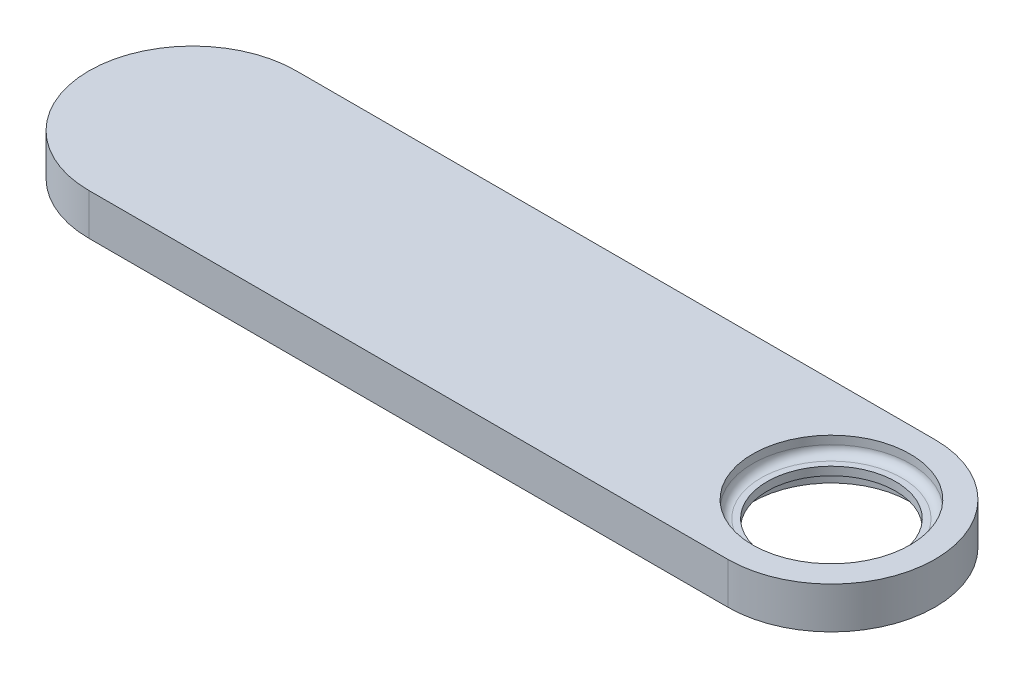
ISO-10303-21;
HEADER;
FILE_DESCRIPTION(('STEP AP214'),'2;1');
FILE_NAME('part.step','',(''),(''),'','','');
FILE_SCHEMA(('AUTOMOTIVE_DESIGN { 1 0 10303 214 1 1 1 1 }'));
ENDSEC;
DATA;
#1=APPLICATION_CONTEXT('core data for automotive mechanical design processes');
#2=APPLICATION_PROTOCOL_DEFINITION('international standard','automotive_design',2000,#1);
#3=PRODUCT_CONTEXT('',#1,'mechanical');
#4=PRODUCT('Part','Part','',(#3));
#5=PRODUCT_RELATED_PRODUCT_CATEGORY('part','',(#4));
#6=PRODUCT_DEFINITION_FORMATION('','',#4);
#7=PRODUCT_DEFINITION_CONTEXT('part definition',#1,'design');
#8=PRODUCT_DEFINITION('design','',#6,#7);
#9=PRODUCT_DEFINITION_SHAPE('','',#8);
#10=(LENGTH_UNIT() NAMED_UNIT(*) SI_UNIT(.MILLI.,.METRE.));
#11=(NAMED_UNIT(*) PLANE_ANGLE_UNIT() SI_UNIT($,.RADIAN.));
#12=(NAMED_UNIT(*) SI_UNIT($,.STERADIAN.) SOLID_ANGLE_UNIT());
#13=UNCERTAINTY_MEASURE_WITH_UNIT(LENGTH_MEASURE(1.E-05),#10,'distance_accuracy_value','');
#14=(GEOMETRIC_REPRESENTATION_CONTEXT(3) GLOBAL_UNCERTAINTY_ASSIGNED_CONTEXT((#13)) GLOBAL_UNIT_ASSIGNED_CONTEXT((#10,
#11,#12)) REPRESENTATION_CONTEXT('',''));
#15=CARTESIAN_POINT('',(0.,0.,0.));
#16=DIRECTION('',(0.,0.,1.));
#17=DIRECTION('',(1.,0.,0.));
#18=AXIS2_PLACEMENT_3D('',#15,#16,#17);
#19=CARTESIAN_POINT('',(38.5204081632653,-0.00100000000000013,0.));
#20=DIRECTION('',(0.,1.,0.));
#21=DIRECTION('',(0.,0.,1.));
#22=AXIS2_PLACEMENT_3D('',#19,#20,#21);
#23=CYLINDRICAL_SURFACE('',#22,7.75);
#24=CARTESIAN_POINT('',(38.5204081632653,3.,0.));
#25=DIRECTION('',(0.,1.,0.));
#26=DIRECTION('',(0.,0.,1.));
#27=AXIS2_PLACEMENT_3D('',#24,#25,#26);
#28=CIRCLE('',#27,7.75);
#29=CARTESIAN_POINT('',(38.5204081632653,3.,7.75));
#30=VERTEX_POINT('',#29);
#31=EDGE_CURVE('E106',#30,#30,#28,.F.);
#32=ORIENTED_EDGE('',*,*,#31,.F.);
#33=EDGE_LOOP('',(#32));
#34=FACE_BOUND('',#33,.T.);
#35=CARTESIAN_POINT('',(38.5204081632653,2.,0.));
#36=DIRECTION('',(0.,-1.,0.));
#37=DIRECTION('',(0.,0.,-1.));
#38=AXIS2_PLACEMENT_3D('',#35,#36,#37);
#39=CIRCLE('',#38,7.75);
#40=CARTESIAN_POINT('',(38.5204081632653,2.,-7.75));
#41=VERTEX_POINT('',#40);
#42=EDGE_CURVE('E117',#41,#41,#39,.F.);
#43=ORIENTED_EDGE('',*,*,#42,.F.);
#44=EDGE_LOOP('',(#43));
#45=FACE_BOUND('',#44,.T.);
#46=ADVANCED_FACE('F35',(#34,#45),#23,.F.);
#47=CARTESIAN_POINT('',(-38.5204081632653,5.,0.));
#48=DIRECTION('',(0.,-1.,0.));
#49=DIRECTION('',(0.,0.,-1.));
#50=AXIS2_PLACEMENT_3D('',#47,#48,#49);
#51=CYLINDRICAL_SURFACE('',#50,12.5);
#52=CARTESIAN_POINT('',(-38.5204081632653,0.,0.));
#53=DIRECTION('',(0.,1.,0.));
#54=DIRECTION('',(0.,0.,1.));
#55=AXIS2_PLACEMENT_3D('',#52,#53,#54);
#56=CIRCLE('',#55,12.5);
#57=CARTESIAN_POINT('',(-38.5204081632653,0.,-12.5));
#58=VERTEX_POINT('',#57);
#59=CARTESIAN_POINT('',(-38.5204081632653,0.,12.5));
#60=VERTEX_POINT('',#59);
#61=EDGE_CURVE('E103',#58,#60,#56,.T.);
#62=ORIENTED_EDGE('',*,*,#61,.T.);
#63=DIRECTION('',(0.,-1.,0.));
#64=VECTOR('',#63,1.);
#65=CARTESIAN_POINT('',(-38.5204081632653,5.,12.5));
#66=LINE('',#65,#64);
#67=CARTESIAN_POINT('',(-38.5204081632653,5.,12.5));
#68=VERTEX_POINT('',#67);
#69=EDGE_CURVE('E94',#68,#60,#66,.T.);
#70=ORIENTED_EDGE('',*,*,#69,.F.);
#71=CARTESIAN_POINT('',(-38.5204081632653,5.,0.));
#72=DIRECTION('',(0.,1.,0.));
#73=DIRECTION('',(0.,0.,1.));
#74=AXIS2_PLACEMENT_3D('',#71,#72,#73);
#75=CIRCLE('',#74,12.5);
#76=CARTESIAN_POINT('',(-38.5204081632653,5.,-12.5));
#77=VERTEX_POINT('',#76);
#78=EDGE_CURVE('E88',#77,#68,#75,.T.);
#79=ORIENTED_EDGE('',*,*,#78,.F.);
#80=DIRECTION('',(0.,-1.,0.));
#81=VECTOR('',#80,1.);
#82=CARTESIAN_POINT('',(-38.5204081632653,5.,-12.5));
#83=LINE('',#82,#81);
#84=EDGE_CURVE('E99',#77,#58,#83,.T.);
#85=ORIENTED_EDGE('',*,*,#84,.T.);
#86=EDGE_LOOP('',(#62,#70,#79,#85));
#87=FACE_BOUND('',#86,.T.);
#88=ADVANCED_FACE('F141',(#87),#51,.T.);
#89=CARTESIAN_POINT('',(-38.5204081632653,5.,12.5));
#90=DIRECTION('',(0.,0.,-1.));
#91=DIRECTION('',(-1.,0.,0.));
#92=AXIS2_PLACEMENT_3D('',#89,#90,#91);
#93=PLANE('',#92);
#94=DIRECTION('',(1.,0.,0.));
#95=VECTOR('',#94,1.);
#96=CARTESIAN_POINT('',(-38.5204081632653,0.,12.5));
#97=LINE('',#96,#95);
#98=CARTESIAN_POINT('',(38.5204081632653,0.,12.5));
#99=VERTEX_POINT('',#98);
#100=EDGE_CURVE('E93',#60,#99,#97,.T.);
#101=ORIENTED_EDGE('',*,*,#100,.T.);
#102=DIRECTION('',(0.,-1.,0.));
#103=VECTOR('',#102,1.);
#104=CARTESIAN_POINT('',(38.5204081632653,5.,12.5));
#105=LINE('',#104,#103);
#106=CARTESIAN_POINT('',(38.5204081632653,5.,12.5));
#107=VERTEX_POINT('',#106);
#108=EDGE_CURVE('E91',#107,#99,#105,.T.);
#109=ORIENTED_EDGE('',*,*,#108,.F.);
#110=DIRECTION('',(1.,0.,0.));
#111=VECTOR('',#110,1.);
#112=CARTESIAN_POINT('',(-38.5204081632653,5.,12.5));
#113=LINE('',#112,#111);
#114=EDGE_CURVE('E83',#68,#107,#113,.T.);
#115=ORIENTED_EDGE('',*,*,#114,.F.);
#116=ORIENTED_EDGE('',*,*,#69,.T.);
#117=EDGE_LOOP('',(#101,#109,#115,#116));
#118=FACE_BOUND('',#117,.T.);
#119=ADVANCED_FACE('F92',(#118),#93,.F.);
#120=CARTESIAN_POINT('',(38.5204081632653,5.,0.));
#121=DIRECTION('',(0.,-1.,0.));
#122=DIRECTION('',(0.,0.,-1.));
#123=AXIS2_PLACEMENT_3D('',#120,#121,#122);
#124=CYLINDRICAL_SURFACE('',#123,12.5);
#125=CARTESIAN_POINT('',(38.5204081632653,0.,0.));
#126=DIRECTION('',(0.,1.,0.));
#127=DIRECTION('',(0.,0.,1.));
#128=AXIS2_PLACEMENT_3D('',#125,#126,#127);
#129=CIRCLE('',#128,12.5);
#130=CARTESIAN_POINT('',(38.5204081632653,0.,-12.5));
#131=VERTEX_POINT('',#130);
#132=EDGE_CURVE('E69',#99,#131,#129,.T.);
#133=ORIENTED_EDGE('',*,*,#132,.T.);
#134=DIRECTION('',(0.,-1.,0.));
#135=VECTOR('',#134,1.);
#136=CARTESIAN_POINT('',(38.5204081632653,5.,-12.5));
#137=LINE('',#136,#135);
#138=CARTESIAN_POINT('',(38.5204081632653,5.,-12.5));
#139=VERTEX_POINT('',#138);
#140=EDGE_CURVE('E95',#139,#131,#137,.T.);
#141=ORIENTED_EDGE('',*,*,#140,.F.);
#142=CARTESIAN_POINT('',(38.5204081632653,5.,0.));
#143=DIRECTION('',(0.,1.,0.));
#144=DIRECTION('',(0.,0.,1.));
#145=AXIS2_PLACEMENT_3D('',#142,#143,#144);
#146=CIRCLE('',#145,12.5);
#147=EDGE_CURVE('E86',#107,#139,#146,.T.);
#148=ORIENTED_EDGE('',*,*,#147,.F.);
#149=ORIENTED_EDGE('',*,*,#108,.T.);
#150=EDGE_LOOP('',(#133,#141,#148,#149));
#151=FACE_BOUND('',#150,.T.);
#152=ADVANCED_FACE('F97',(#151),#124,.T.);
#153=CARTESIAN_POINT('',(-38.5204081632653,5.,-12.5));
#154=DIRECTION('',(0.,0.,1.));
#155=DIRECTION('',(1.,0.,0.));
#156=AXIS2_PLACEMENT_3D('',#153,#154,#155);
#157=PLANE('',#156);
#158=DIRECTION('',(-1.,0.,0.));
#159=VECTOR('',#158,1.);
#160=CARTESIAN_POINT('',(-38.5204081632653,0.,-12.5));
#161=LINE('',#160,#159);
#162=EDGE_CURVE('E75',#131,#58,#161,.T.);
#163=ORIENTED_EDGE('',*,*,#162,.T.);
#164=ORIENTED_EDGE('',*,*,#84,.F.);
#165=DIRECTION('',(-1.,0.,0.));
#166=VECTOR('',#165,1.);
#167=CARTESIAN_POINT('',(-38.5204081632653,5.,-12.5));
#168=LINE('',#167,#166);
#169=EDGE_CURVE('E52',#139,#77,#168,.T.);
#170=ORIENTED_EDGE('',*,*,#169,.F.);
#171=ORIENTED_EDGE('',*,*,#140,.T.);
#172=EDGE_LOOP('',(#163,#164,#170,#171));
#173=FACE_BOUND('',#172,.T.);
#174=ADVANCED_FACE('F158',(#173),#157,.F.);
#175=CARTESIAN_POINT('',(-38.5204081632653,5.,0.));
#176=DIRECTION('',(0.,1.,0.));
#177=DIRECTION('',(0.,0.,1.));
#178=AXIS2_PLACEMENT_3D('',#175,#176,#177);
#179=PLANE('',#178);
#180=CARTESIAN_POINT('',(38.5204081632653,5.,0.));
#181=DIRECTION('',(0.,1.,0.));
#182=DIRECTION('',(0.,0.,1.));
#183=AXIS2_PLACEMENT_3D('',#180,#181,#182);
#184=CIRCLE('',#183,9.5);
#185=CARTESIAN_POINT('',(38.5204081632653,5.,9.5));
#186=VERTEX_POINT('',#185);
#187=EDGE_CURVE('E116',#186,#186,#184,.T.);
#188=ORIENTED_EDGE('',*,*,#187,.F.);
#189=EDGE_LOOP('',(#188));
#190=FACE_BOUND('',#189,.T.);
#191=ORIENTED_EDGE('',*,*,#78,.T.);
#192=ORIENTED_EDGE('',*,*,#114,.T.);
#193=ORIENTED_EDGE('',*,*,#147,.T.);
#194=ORIENTED_EDGE('',*,*,#169,.T.);
#195=EDGE_LOOP('',(#191,#192,#193,#194));
#196=FACE_BOUND('',#195,.T.);
#197=ADVANCED_FACE('F84',(#190,#196),#179,.T.);
#198=CARTESIAN_POINT('',(-38.5204081632653,0.,0.));
#199=DIRECTION('',(0.,1.,0.));
#200=DIRECTION('',(0.,0.,1.));
#201=AXIS2_PLACEMENT_3D('',#198,#199,#200);
#202=PLANE('',#201);
#203=CARTESIAN_POINT('',(38.5204081632653,0.,0.));
#204=DIRECTION('',(0.,-1.,0.));
#205=DIRECTION('',(0.,0.,-1.));
#206=AXIS2_PLACEMENT_3D('',#203,#204,#205);
#207=CIRCLE('',#206,9.5);
#208=CARTESIAN_POINT('',(38.5204081632653,0.,-9.5));
#209=VERTEX_POINT('',#208);
#210=EDGE_CURVE('E120',#209,#209,#207,.T.);
#211=ORIENTED_EDGE('',*,*,#210,.F.);
#212=EDGE_LOOP('',(#211));
#213=FACE_BOUND('',#212,.T.);
#214=ORIENTED_EDGE('',*,*,#61,.F.);
#215=ORIENTED_EDGE('',*,*,#162,.F.);
#216=ORIENTED_EDGE('',*,*,#132,.F.);
#217=ORIENTED_EDGE('',*,*,#100,.F.);
#218=EDGE_LOOP('',(#214,#215,#216,#217));
#219=FACE_BOUND('',#218,.T.);
#220=ADVANCED_FACE('F157',(#213,#219),#202,.F.);
#221=CARTESIAN_POINT('',(38.5204081632653,3.,0.));
#222=DIRECTION('',(0.,1.,0.));
#223=DIRECTION('',(0.,0.,1.));
#224=AXIS2_PLACEMENT_3D('',#221,#222,#223);
#225=PLANE('',#224);
#226=CARTESIAN_POINT('',(38.5204081632653,3.,0.));
#227=DIRECTION('',(0.,1.,0.));
#228=DIRECTION('',(0.,0.,1.));
#229=AXIS2_PLACEMENT_3D('',#226,#227,#228);
#230=CIRCLE('',#229,8.5);
#231=CARTESIAN_POINT('',(38.5204081632653,3.,8.5));
#232=VERTEX_POINT('',#231);
#233=EDGE_CURVE('E113',#232,#232,#230,.T.);
#234=ORIENTED_EDGE('',*,*,#233,.T.);
#235=EDGE_LOOP('',(#234));
#236=FACE_BOUND('',#235,.T.);
#237=ORIENTED_EDGE('',*,*,#31,.T.);
#238=EDGE_LOOP('',(#237));
#239=FACE_BOUND('',#238,.T.);
#240=ADVANCED_FACE('F162',(#236,#239),#225,.T.);
#241=CARTESIAN_POINT('',(38.5204081632653,3.,0.));
#242=DIRECTION('',(0.,1.,0.));
#243=DIRECTION('',(0.,0.,1.));
#244=AXIS2_PLACEMENT_3D('',#241,#242,#243);
#245=CYLINDRICAL_SURFACE('',#244,9.5);
#246=CARTESIAN_POINT('',(38.5204081632653,4.,0.));
#247=DIRECTION('',(0.,1.,0.));
#248=DIRECTION('',(0.,0.,1.));
#249=AXIS2_PLACEMENT_3D('',#246,#247,#248);
#250=CIRCLE('',#249,9.5);
#251=CARTESIAN_POINT('',(38.5204081632653,4.,9.5));
#252=VERTEX_POINT('',#251);
#253=EDGE_CURVE('E123',#252,#252,#250,.F.);
#254=ORIENTED_EDGE('',*,*,#253,.T.);
#255=EDGE_LOOP('',(#254));
#256=FACE_BOUND('',#255,.T.);
#257=ORIENTED_EDGE('',*,*,#187,.T.);
#258=EDGE_LOOP('',(#257));
#259=FACE_BOUND('',#258,.T.);
#260=ADVANCED_FACE('F153',(#256,#259),#245,.F.);
#261=CARTESIAN_POINT('',(38.5204081632653,2.,0.));
#262=DIRECTION('',(0.,-1.,0.));
#263=DIRECTION('',(0.,0.,-1.));
#264=AXIS2_PLACEMENT_3D('',#261,#262,#263);
#265=PLANE('',#264);
#266=CARTESIAN_POINT('',(38.5204081632653,2.,0.));
#267=DIRECTION('',(0.,-1.,0.));
#268=DIRECTION('',(0.,0.,-1.));
#269=AXIS2_PLACEMENT_3D('',#266,#267,#268);
#270=CIRCLE('',#269,8.5);
#271=CARTESIAN_POINT('',(38.5204081632653,2.,-8.5));
#272=VERTEX_POINT('',#271);
#273=EDGE_CURVE('E44',#272,#272,#270,.T.);
#274=ORIENTED_EDGE('',*,*,#273,.T.);
#275=EDGE_LOOP('',(#274));
#276=FACE_BOUND('',#275,.T.);
#277=ORIENTED_EDGE('',*,*,#42,.T.);
#278=EDGE_LOOP('',(#277));
#279=FACE_BOUND('',#278,.T.);
#280=ADVANCED_FACE('F128',(#276,#279),#265,.T.);
#281=CARTESIAN_POINT('',(38.5204081632653,2.,0.));
#282=DIRECTION('',(0.,-1.,0.));
#283=DIRECTION('',(0.,0.,-1.));
#284=AXIS2_PLACEMENT_3D('',#281,#282,#283);
#285=CYLINDRICAL_SURFACE('',#284,9.5);
#286=CARTESIAN_POINT('',(38.5204081632653,1.,0.));
#287=DIRECTION('',(0.,-1.,0.));
#288=DIRECTION('',(0.,0.,-1.));
#289=AXIS2_PLACEMENT_3D('',#286,#287,#288);
#290=CIRCLE('',#289,9.5);
#291=CARTESIAN_POINT('',(38.5204081632653,1.,-9.5));
#292=VERTEX_POINT('',#291);
#293=EDGE_CURVE('E11',#292,#292,#290,.F.);
#294=ORIENTED_EDGE('',*,*,#293,.T.);
#295=EDGE_LOOP('',(#294));
#296=FACE_BOUND('',#295,.T.);
#297=ORIENTED_EDGE('',*,*,#210,.T.);
#298=EDGE_LOOP('',(#297));
#299=FACE_BOUND('',#298,.T.);
#300=ADVANCED_FACE('F137',(#296,#299),#285,.F.);
#301=CARTESIAN_POINT('',(38.5204081632653,4.,0.));
#302=DIRECTION('',(0.,1.,0.));
#303=DIRECTION('',(0.,0.,1.));
#304=AXIS2_PLACEMENT_3D('',#301,#302,#303);
#305=TOROIDAL_SURFACE('',#304,8.5,1.);
#306=ORIENTED_EDGE('',*,*,#253,.F.);
#307=EDGE_LOOP('',(#306));
#308=FACE_BOUND('',#307,.T.);
#309=ORIENTED_EDGE('',*,*,#233,.F.);
#310=EDGE_LOOP('',(#309));
#311=FACE_BOUND('',#310,.T.);
#312=ADVANCED_FACE('F132',(#308,#311),#305,.F.);
#313=CARTESIAN_POINT('',(38.5204081632653,1.,0.));
#314=DIRECTION('',(0.,-1.,0.));
#315=DIRECTION('',(0.,0.,-1.));
#316=AXIS2_PLACEMENT_3D('',#313,#314,#315);
#317=TOROIDAL_SURFACE('',#316,8.5,1.);
#318=ORIENTED_EDGE('',*,*,#293,.F.);
#319=EDGE_LOOP('',(#318));
#320=FACE_BOUND('',#319,.T.);
#321=ORIENTED_EDGE('',*,*,#273,.F.);
#322=EDGE_LOOP('',(#321));
#323=FACE_BOUND('',#322,.T.);
#324=ADVANCED_FACE('F37',(#320,#323),#317,.F.);
#325=CLOSED_SHELL('',(#46,#88,#119,#152,#174,#197,#220,#240,#260,#280,#300,#312,#324));
#326=MANIFOLD_SOLID_BREP('B2',#325);
#327=ADVANCED_BREP_SHAPE_REPRESENTATION('',(#18,#326),#14);
#328=SHAPE_DEFINITION_REPRESENTATION(#9,#327);
ENDSEC;
END-ISO-10303-21;
